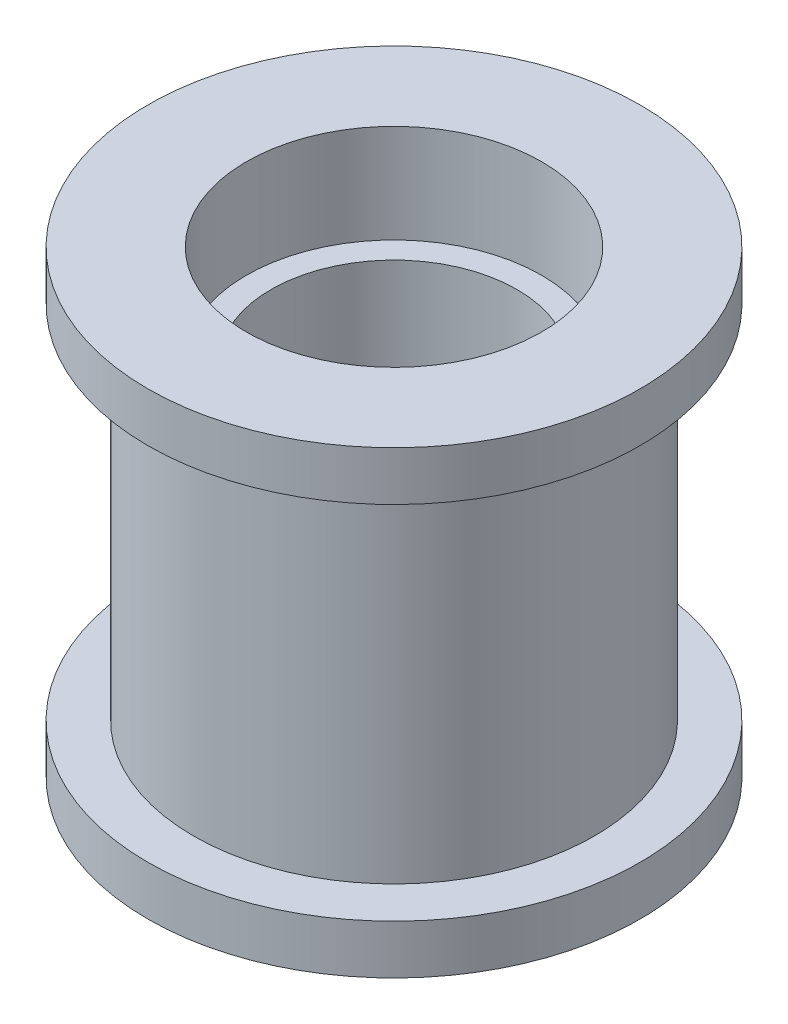
ISO-10303-21;
HEADER;
FILE_DESCRIPTION(('STEP AP214'),'2;1');
FILE_NAME('part.step','',(''),(''),'','','');
FILE_SCHEMA(('AUTOMOTIVE_DESIGN { 1 0 10303 214 1 1 1 1 }'));
ENDSEC;
DATA;
#1=APPLICATION_CONTEXT('core data for automotive mechanical design processes');
#2=APPLICATION_PROTOCOL_DEFINITION('international standard','automotive_design',2000,#1);
#3=PRODUCT_CONTEXT('',#1,'mechanical');
#4=PRODUCT('Part','Part','',(#3));
#5=PRODUCT_RELATED_PRODUCT_CATEGORY('part','',(#4));
#6=PRODUCT_DEFINITION_FORMATION('','',#4);
#7=PRODUCT_DEFINITION_CONTEXT('part definition',#1,'design');
#8=PRODUCT_DEFINITION('design','',#6,#7);
#9=PRODUCT_DEFINITION_SHAPE('','',#8);
#10=(LENGTH_UNIT() NAMED_UNIT(*) SI_UNIT(.MILLI.,.METRE.));
#11=(NAMED_UNIT(*) PLANE_ANGLE_UNIT() SI_UNIT($,.RADIAN.));
#12=(NAMED_UNIT(*) SI_UNIT($,.STERADIAN.) SOLID_ANGLE_UNIT());
#13=UNCERTAINTY_MEASURE_WITH_UNIT(LENGTH_MEASURE(1.E-05),#10,'distance_accuracy_value','');
#14=(GEOMETRIC_REPRESENTATION_CONTEXT(3) GLOBAL_UNCERTAINTY_ASSIGNED_CONTEXT((#13)) GLOBAL_UNIT_ASSIGNED_CONTEXT((#10,
#11,#12)) REPRESENTATION_CONTEXT('',''));
#15=CARTESIAN_POINT('',(0.,0.,0.));
#16=DIRECTION('',(0.,0.,1.));
#17=DIRECTION('',(1.,0.,0.));
#18=AXIS2_PLACEMENT_3D('',#15,#16,#17);
#19=CARTESIAN_POINT('',(-7.5,0.,0.));
#20=DIRECTION('',(0.,1.,0.));
#21=DIRECTION('',(0.,0.,1.));
#22=AXIS2_PLACEMENT_3D('',#19,#20,#21);
#23=PLANE('',#22);
#24=CARTESIAN_POINT('',(0.,0.,0.));
#25=DIRECTION('',(0.,-1.,0.));
#26=DIRECTION('',(0.,0.,-1.));
#27=AXIS2_PLACEMENT_3D('',#24,#25,#26);
#28=CIRCLE('',#27,4.5);
#29=CARTESIAN_POINT('',(0.,0.,-4.5));
#30=VERTEX_POINT('',#29);
#31=EDGE_CURVE('E10',#30,#30,#28,.T.);
#32=ORIENTED_EDGE('',*,*,#31,.F.);
#33=EDGE_LOOP('',(#32));
#34=FACE_BOUND('',#33,.T.);
#35=CARTESIAN_POINT('',(0.,0.,0.));
#36=DIRECTION('',(0.,-1.,0.));
#37=DIRECTION('',(0.,0.,-1.));
#38=AXIS2_PLACEMENT_3D('',#35,#36,#37);
#39=CIRCLE('',#38,7.5);
#40=CARTESIAN_POINT('',(0.,0.,-7.5));
#41=VERTEX_POINT('',#40);
#42=EDGE_CURVE('E72',#41,#41,#39,.T.);
#43=ORIENTED_EDGE('',*,*,#42,.T.);
#44=EDGE_LOOP('',(#43));
#45=FACE_BOUND('',#44,.T.);
#46=ADVANCED_FACE('F32',(#34,#45),#23,.F.);
#47=CARTESIAN_POINT('',(0.,0.,0.));
#48=DIRECTION('',(0.,-1.,0.));
#49=DIRECTION('',(0.,0.,-1.));
#50=AXIS2_PLACEMENT_3D('',#47,#48,#49);
#51=CYLINDRICAL_SURFACE('',#50,4.5);
#52=CARTESIAN_POINT('',(0.,3.,0.));
#53=DIRECTION('',(0.,-1.,0.));
#54=DIRECTION('',(0.,0.,-1.));
#55=AXIS2_PLACEMENT_3D('',#52,#53,#54);
#56=CIRCLE('',#55,4.5);
#57=CARTESIAN_POINT('',(0.,3.,-4.5));
#58=VERTEX_POINT('',#57);
#59=EDGE_CURVE('E38',#58,#58,#56,.T.);
#60=ORIENTED_EDGE('',*,*,#59,.F.);
#61=EDGE_LOOP('',(#60));
#62=FACE_BOUND('',#61,.T.);
#63=ORIENTED_EDGE('',*,*,#31,.T.);
#64=EDGE_LOOP('',(#63));
#65=FACE_BOUND('',#64,.T.);
#66=ADVANCED_FACE('F133',(#62,#65),#51,.F.);
#67=CARTESIAN_POINT('',(-4.5,3.,0.));
#68=DIRECTION('',(0.,1.,0.));
#69=DIRECTION('',(0.,0.,1.));
#70=AXIS2_PLACEMENT_3D('',#67,#68,#69);
#71=PLANE('',#70);
#72=CARTESIAN_POINT('',(0.,3.,0.));
#73=DIRECTION('',(0.,-1.,0.));
#74=DIRECTION('',(0.,0.,-1.));
#75=AXIS2_PLACEMENT_3D('',#72,#73,#74);
#76=CIRCLE('',#75,3.75);
#77=CARTESIAN_POINT('',(0.,3.,-3.75));
#78=VERTEX_POINT('',#77);
#79=EDGE_CURVE('E42',#78,#78,#76,.T.);
#80=ORIENTED_EDGE('',*,*,#79,.F.);
#81=EDGE_LOOP('',(#80));
#82=FACE_BOUND('',#81,.T.);
#83=ORIENTED_EDGE('',*,*,#59,.T.);
#84=EDGE_LOOP('',(#83));
#85=FACE_BOUND('',#84,.T.);
#86=ADVANCED_FACE('F128',(#82,#85),#71,.F.);
#87=CARTESIAN_POINT('',(0.,0.,0.));
#88=DIRECTION('',(0.,-1.,0.));
#89=DIRECTION('',(0.,0.,-1.));
#90=AXIS2_PLACEMENT_3D('',#87,#88,#89);
#91=CYLINDRICAL_SURFACE('',#90,3.75);
#92=CARTESIAN_POINT('',(0.,11.,0.));
#93=DIRECTION('',(0.,-1.,0.));
#94=DIRECTION('',(0.,0.,-1.));
#95=AXIS2_PLACEMENT_3D('',#92,#93,#94);
#96=CIRCLE('',#95,3.75);
#97=CARTESIAN_POINT('',(0.,11.,-3.75));
#98=VERTEX_POINT('',#97);
#99=EDGE_CURVE('E46',#98,#98,#96,.T.);
#100=ORIENTED_EDGE('',*,*,#99,.F.);
#101=EDGE_LOOP('',(#100));
#102=FACE_BOUND('',#101,.T.);
#103=ORIENTED_EDGE('',*,*,#79,.T.);
#104=EDGE_LOOP('',(#103));
#105=FACE_BOUND('',#104,.T.);
#106=ADVANCED_FACE('F122',(#102,#105),#91,.F.);
#107=CARTESIAN_POINT('',(-3.75,11.,0.));
#108=DIRECTION('',(0.,-1.,0.));
#109=DIRECTION('',(0.,0.,-1.));
#110=AXIS2_PLACEMENT_3D('',#107,#108,#109);
#111=PLANE('',#110);
#112=CARTESIAN_POINT('',(0.,11.,0.));
#113=DIRECTION('',(0.,-1.,0.));
#114=DIRECTION('',(0.,0.,-1.));
#115=AXIS2_PLACEMENT_3D('',#112,#113,#114);
#116=CIRCLE('',#115,4.5);
#117=CARTESIAN_POINT('',(0.,11.,-4.5));
#118=VERTEX_POINT('',#117);
#119=EDGE_CURVE('E51',#118,#118,#116,.T.);
#120=ORIENTED_EDGE('',*,*,#119,.F.);
#121=EDGE_LOOP('',(#120));
#122=FACE_BOUND('',#121,.T.);
#123=ORIENTED_EDGE('',*,*,#99,.T.);
#124=EDGE_LOOP('',(#123));
#125=FACE_BOUND('',#124,.T.);
#126=ADVANCED_FACE('F116',(#122,#125),#111,.F.);
#127=CARTESIAN_POINT('',(0.,0.,0.));
#128=DIRECTION('',(0.,-1.,0.));
#129=DIRECTION('',(0.,0.,-1.));
#130=AXIS2_PLACEMENT_3D('',#127,#128,#129);
#131=CYLINDRICAL_SURFACE('',#130,4.5);
#132=CARTESIAN_POINT('',(0.,14.,0.));
#133=DIRECTION('',(0.,-1.,0.));
#134=DIRECTION('',(0.,0.,-1.));
#135=AXIS2_PLACEMENT_3D('',#132,#133,#134);
#136=CIRCLE('',#135,4.5);
#137=CARTESIAN_POINT('',(0.,14.,-4.5));
#138=VERTEX_POINT('',#137);
#139=EDGE_CURVE('E54',#138,#138,#136,.T.);
#140=ORIENTED_EDGE('',*,*,#139,.F.);
#141=EDGE_LOOP('',(#140));
#142=FACE_BOUND('',#141,.T.);
#143=ORIENTED_EDGE('',*,*,#119,.T.);
#144=EDGE_LOOP('',(#143));
#145=FACE_BOUND('',#144,.T.);
#146=ADVANCED_FACE('F110',(#142,#145),#131,.F.);
#147=CARTESIAN_POINT('',(-4.5,14.,0.));
#148=DIRECTION('',(0.,-1.,0.));
#149=DIRECTION('',(0.,0.,-1.));
#150=AXIS2_PLACEMENT_3D('',#147,#148,#149);
#151=PLANE('',#150);
#152=CARTESIAN_POINT('',(0.,14.,0.));
#153=DIRECTION('',(0.,-1.,0.));
#154=DIRECTION('',(0.,0.,-1.));
#155=AXIS2_PLACEMENT_3D('',#152,#153,#154);
#156=CIRCLE('',#155,7.5);
#157=CARTESIAN_POINT('',(0.,14.,-7.5));
#158=VERTEX_POINT('',#157);
#159=EDGE_CURVE('E57',#158,#158,#156,.T.);
#160=ORIENTED_EDGE('',*,*,#159,.F.);
#161=EDGE_LOOP('',(#160));
#162=FACE_BOUND('',#161,.T.);
#163=ORIENTED_EDGE('',*,*,#139,.T.);
#164=EDGE_LOOP('',(#163));
#165=FACE_BOUND('',#164,.T.);
#166=ADVANCED_FACE('F104',(#162,#165),#151,.F.);
#167=CARTESIAN_POINT('',(0.,0.,0.));
#168=DIRECTION('',(0.,-1.,0.));
#169=DIRECTION('',(0.,0.,-1.));
#170=AXIS2_PLACEMENT_3D('',#167,#168,#169);
#171=CYLINDRICAL_SURFACE('',#170,7.5);
#172=CARTESIAN_POINT('',(0.,12.5,0.));
#173=DIRECTION('',(0.,-1.,0.));
#174=DIRECTION('',(0.,0.,-1.));
#175=AXIS2_PLACEMENT_3D('',#172,#173,#174);
#176=CIRCLE('',#175,7.5);
#177=CARTESIAN_POINT('',(0.,12.5,-7.5));
#178=VERTEX_POINT('',#177);
#179=EDGE_CURVE('E60',#178,#178,#176,.T.);
#180=ORIENTED_EDGE('',*,*,#179,.F.);
#181=EDGE_LOOP('',(#180));
#182=FACE_BOUND('',#181,.T.);
#183=ORIENTED_EDGE('',*,*,#159,.T.);
#184=EDGE_LOOP('',(#183));
#185=FACE_BOUND('',#184,.T.);
#186=ADVANCED_FACE('F98',(#182,#185),#171,.T.);
#187=CARTESIAN_POINT('',(-7.5,12.5,0.));
#188=DIRECTION('',(0.,1.,0.));
#189=DIRECTION('',(0.,0.,1.));
#190=AXIS2_PLACEMENT_3D('',#187,#188,#189);
#191=PLANE('',#190);
#192=CARTESIAN_POINT('',(0.,12.5,0.));
#193=DIRECTION('',(0.,-1.,0.));
#194=DIRECTION('',(0.,0.,-1.));
#195=AXIS2_PLACEMENT_3D('',#192,#193,#194);
#196=CIRCLE('',#195,6.11);
#197=CARTESIAN_POINT('',(0.,12.5,-6.11));
#198=VERTEX_POINT('',#197);
#199=EDGE_CURVE('E63',#198,#198,#196,.T.);
#200=ORIENTED_EDGE('',*,*,#199,.F.);
#201=EDGE_LOOP('',(#200));
#202=FACE_BOUND('',#201,.T.);
#203=ORIENTED_EDGE('',*,*,#179,.T.);
#204=EDGE_LOOP('',(#203));
#205=FACE_BOUND('',#204,.T.);
#206=ADVANCED_FACE('F92',(#202,#205),#191,.F.);
#207=CARTESIAN_POINT('',(0.,0.,0.));
#208=DIRECTION('',(0.,-1.,0.));
#209=DIRECTION('',(0.,0.,-1.));
#210=AXIS2_PLACEMENT_3D('',#207,#208,#209);
#211=CYLINDRICAL_SURFACE('',#210,6.11);
#212=CARTESIAN_POINT('',(0.,1.5,0.));
#213=DIRECTION('',(0.,-1.,0.));
#214=DIRECTION('',(0.,0.,-1.));
#215=AXIS2_PLACEMENT_3D('',#212,#213,#214);
#216=CIRCLE('',#215,6.11);
#217=CARTESIAN_POINT('',(0.,1.5,-6.11));
#218=VERTEX_POINT('',#217);
#219=EDGE_CURVE('E66',#218,#218,#216,.T.);
#220=ORIENTED_EDGE('',*,*,#219,.F.);
#221=EDGE_LOOP('',(#220));
#222=FACE_BOUND('',#221,.T.);
#223=ORIENTED_EDGE('',*,*,#199,.T.);
#224=EDGE_LOOP('',(#223));
#225=FACE_BOUND('',#224,.T.);
#226=ADVANCED_FACE('F86',(#222,#225),#211,.T.);
#227=CARTESIAN_POINT('',(-6.11,1.5,0.));
#228=DIRECTION('',(0.,-1.,0.));
#229=DIRECTION('',(0.,0.,-1.));
#230=AXIS2_PLACEMENT_3D('',#227,#228,#229);
#231=PLANE('',#230);
#232=CARTESIAN_POINT('',(0.,1.5,0.));
#233=DIRECTION('',(0.,-1.,0.));
#234=DIRECTION('',(0.,0.,-1.));
#235=AXIS2_PLACEMENT_3D('',#232,#233,#234);
#236=CIRCLE('',#235,7.5);
#237=CARTESIAN_POINT('',(0.,1.5,-7.5));
#238=VERTEX_POINT('',#237);
#239=EDGE_CURVE('E69',#238,#238,#236,.T.);
#240=ORIENTED_EDGE('',*,*,#239,.F.);
#241=EDGE_LOOP('',(#240));
#242=FACE_BOUND('',#241,.T.);
#243=ORIENTED_EDGE('',*,*,#219,.T.);
#244=EDGE_LOOP('',(#243));
#245=FACE_BOUND('',#244,.T.);
#246=ADVANCED_FACE('F80',(#242,#245),#231,.F.);
#247=CARTESIAN_POINT('',(0.,0.,0.));
#248=DIRECTION('',(0.,-1.,0.));
#249=DIRECTION('',(0.,0.,-1.));
#250=AXIS2_PLACEMENT_3D('',#247,#248,#249);
#251=CYLINDRICAL_SURFACE('',#250,7.5);
#252=ORIENTED_EDGE('',*,*,#42,.F.);
#253=EDGE_LOOP('',(#252));
#254=FACE_BOUND('',#253,.T.);
#255=ORIENTED_EDGE('',*,*,#239,.T.);
#256=EDGE_LOOP('',(#255));
#257=FACE_BOUND('',#256,.T.);
#258=ADVANCED_FACE('F77',(#254,#257),#251,.T.);
#259=CLOSED_SHELL('',(#46,#66,#86,#106,#126,#146,#166,#186,#206,#226,#246,#258));
#260=MANIFOLD_SOLID_BREP('B2',#259);
#261=ADVANCED_BREP_SHAPE_REPRESENTATION('',(#18,#260),#14);
#262=SHAPE_DEFINITION_REPRESENTATION(#9,#261);
ENDSEC;
END-ISO-10303-21;
